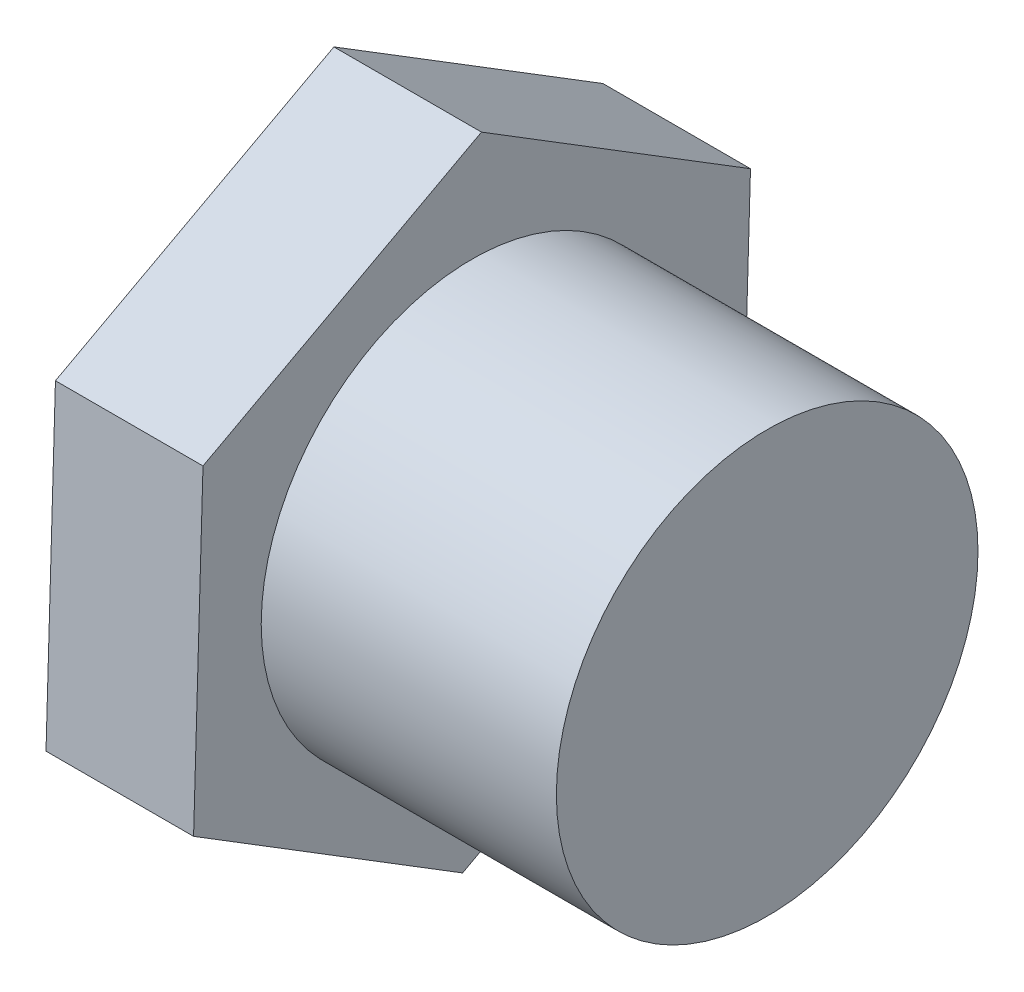
ISO-10303-21;
HEADER;
FILE_DESCRIPTION(('STEP AP214'),'2;1');
FILE_NAME('part.step','',(''),(''),'','','');
FILE_SCHEMA(('AUTOMOTIVE_DESIGN { 1 0 10303 214 1 1 1 1 }'));
ENDSEC;
DATA;
#1=APPLICATION_CONTEXT('core data for automotive mechanical design processes');
#2=APPLICATION_PROTOCOL_DEFINITION('international standard','automotive_design',2000,#1);
#3=PRODUCT_CONTEXT('',#1,'mechanical');
#4=PRODUCT('Part','Part','',(#3));
#5=PRODUCT_RELATED_PRODUCT_CATEGORY('part','',(#4));
#6=PRODUCT_DEFINITION_FORMATION('','',#4);
#7=PRODUCT_DEFINITION_CONTEXT('part definition',#1,'design');
#8=PRODUCT_DEFINITION('design','',#6,#7);
#9=PRODUCT_DEFINITION_SHAPE('','',#8);
#10=(LENGTH_UNIT() NAMED_UNIT(*) SI_UNIT(.MILLI.,.METRE.));
#11=(NAMED_UNIT(*) PLANE_ANGLE_UNIT() SI_UNIT($,.RADIAN.));
#12=(NAMED_UNIT(*) SI_UNIT($,.STERADIAN.) SOLID_ANGLE_UNIT());
#13=UNCERTAINTY_MEASURE_WITH_UNIT(LENGTH_MEASURE(1.E-05),#10,'distance_accuracy_value','');
#14=(GEOMETRIC_REPRESENTATION_CONTEXT(3) GLOBAL_UNCERTAINTY_ASSIGNED_CONTEXT((#13)) GLOBAL_UNIT_ASSIGNED_CONTEXT((#10,
#11,#12)) REPRESENTATION_CONTEXT('',''));
#15=CARTESIAN_POINT('',(0.,0.,0.));
#16=DIRECTION('',(0.,0.,1.));
#17=DIRECTION('',(1.,0.,0.));
#18=AXIS2_PLACEMENT_3D('',#15,#16,#17);
#19=CARTESIAN_POINT('',(-7.,0.,0.));
#20=DIRECTION('',(-1.,0.,0.));
#21=DIRECTION('',(0.,0.,1.));
#22=AXIS2_PLACEMENT_3D('',#19,#20,#21);
#23=PLANE('',#22);
#24=DIRECTION('',(0.,0.999555066672969,-0.0298273144683955));
#25=VECTOR('',#24,1.);
#26=CARTESIAN_POINT('',(-7.,0.387468180844465,12.9846012033036));
#27=LINE('',#26,#25);
#28=CARTESIAN_POINT('',(-7.,-7.10919481920279,13.2083060618166));
#29=VERTEX_POINT('',#28);
#30=CARTESIAN_POINT('',(-7.,7.88413118089174,12.7608963447906));
#31=VERTEX_POINT('',#30);
#32=EDGE_CURVE('E124',#29,#31,#27,.T.);
#33=ORIENTED_EDGE('',*,*,#32,.T.);
#34=DIRECTION('',(0.,0.473946321280187,-0.880553737454437));
#35=VECTOR('',#34,1.);
#36=CARTESIAN_POINT('',(-7.,11.4387285904931,6.15674331388235));
#37=LINE('',#36,#35);
#38=CARTESIAN_POINT('',(-7.,14.9933260000945,-0.447409717025914));
#39=VERTEX_POINT('',#38);
#40=EDGE_CURVE('E109',#31,#39,#37,.T.);
#41=ORIENTED_EDGE('',*,*,#40,.T.);
#42=DIRECTION('',(0.,-0.525608745392782,-0.850726422986042));
#43=VECTOR('',#42,1.);
#44=CARTESIAN_POINT('',(-7.,11.0512604096487,-6.82785788942124));
#45=LINE('',#44,#43);
#46=CARTESIAN_POINT('',(-7.,7.10919481920279,-13.2083060618166));
#47=VERTEX_POINT('',#46);
#48=EDGE_CURVE('E168',#39,#47,#45,.T.);
#49=ORIENTED_EDGE('',*,*,#48,.T.);
#50=DIRECTION('',(0.,-0.999555066672969,0.0298273144683954));
#51=VECTOR('',#50,1.);
#52=CARTESIAN_POINT('',(-7.,-0.387468180844463,-12.9846012033036));
#53=LINE('',#52,#51);
#54=CARTESIAN_POINT('',(-7.,-7.88413118089174,-12.7608963447906));
#55=VERTEX_POINT('',#54);
#56=EDGE_CURVE('E82',#47,#55,#53,.T.);
#57=ORIENTED_EDGE('',*,*,#56,.T.);
#58=DIRECTION('',(0.,-0.473946321280187,0.880553737454437));
#59=VECTOR('',#58,1.);
#60=CARTESIAN_POINT('',(-7.,-11.4387285904931,-6.15674331388235));
#61=LINE('',#60,#59);
#62=CARTESIAN_POINT('',(-7.,-14.9933260000945,0.447409717025928));
#63=VERTEX_POINT('',#62);
#64=EDGE_CURVE('E127',#55,#63,#61,.T.);
#65=ORIENTED_EDGE('',*,*,#64,.T.);
#66=DIRECTION('',(0.,0.525608745392782,0.850726422986042));
#67=VECTOR('',#66,1.);
#68=CARTESIAN_POINT('',(-7.,-11.0512604096487,6.82785788942124));
#69=LINE('',#68,#67);
#70=EDGE_CURVE('E132',#63,#29,#69,.T.);
#71=ORIENTED_EDGE('',*,*,#70,.T.);
#72=EDGE_LOOP('',(#33,#41,#49,#57,#65,#71));
#73=FACE_BOUND('',#72,.T.);
#74=ADVANCED_FACE('F58',(#73),#23,.T.);
#75=CARTESIAN_POINT('',(0.,0.,0.));
#76=DIRECTION('',(-1.,0.,0.));
#77=DIRECTION('',(0.,0.,1.));
#78=AXIS2_PLACEMENT_3D('',#75,#76,#77);
#79=PLANE('',#78);
#80=CARTESIAN_POINT('',(0.,0.,0.));
#81=DIRECTION('',(1.,0.,0.));
#82=DIRECTION('',(0.,0.,-1.));
#83=AXIS2_PLACEMENT_3D('',#80,#81,#82);
#84=CIRCLE('',#83,10.);
#85=CARTESIAN_POINT('',(0.,0.,-10.));
#86=VERTEX_POINT('',#85);
#87=EDGE_CURVE('E144',#86,#86,#84,.T.);
#88=ORIENTED_EDGE('',*,*,#87,.F.);
#89=EDGE_LOOP('',(#88));
#90=FACE_BOUND('',#89,.T.);
#91=DIRECTION('',(0.,0.473946321280187,-0.880553737454437));
#92=VECTOR('',#91,1.);
#93=CARTESIAN_POINT('',(0.,11.4387285904931,6.15674331388235));
#94=LINE('',#93,#92);
#95=CARTESIAN_POINT('',(0.,7.88413118089174,12.7608963447906));
#96=VERTEX_POINT('',#95);
#97=CARTESIAN_POINT('',(0.,14.9933260000945,-0.447409717025914));
#98=VERTEX_POINT('',#97);
#99=EDGE_CURVE('E73',#96,#98,#94,.T.);
#100=ORIENTED_EDGE('',*,*,#99,.F.);
#101=DIRECTION('',(0.,0.999555066672969,-0.0298273144683955));
#102=VECTOR('',#101,1.);
#103=CARTESIAN_POINT('',(0.,0.387468180844465,12.9846012033036));
#104=LINE('',#103,#102);
#105=CARTESIAN_POINT('',(0.,-7.10919481920279,13.2083060618166));
#106=VERTEX_POINT('',#105);
#107=EDGE_CURVE('E126',#106,#96,#104,.T.);
#108=ORIENTED_EDGE('',*,*,#107,.F.);
#109=DIRECTION('',(0.,0.525608745392782,0.850726422986042));
#110=VECTOR('',#109,1.);
#111=CARTESIAN_POINT('',(0.,-11.0512604096487,6.82785788942123));
#112=LINE('',#111,#110);
#113=CARTESIAN_POINT('',(0.,-14.9933260000945,0.447409717025928));
#114=VERTEX_POINT('',#113);
#115=EDGE_CURVE('E161',#114,#106,#112,.T.);
#116=ORIENTED_EDGE('',*,*,#115,.F.);
#117=DIRECTION('',(0.,-0.473946321280187,0.880553737454437));
#118=VECTOR('',#117,1.);
#119=CARTESIAN_POINT('',(0.,-11.4387285904931,-6.15674331388235));
#120=LINE('',#119,#118);
#121=CARTESIAN_POINT('',(0.,-7.88413118089174,-12.7608963447906));
#122=VERTEX_POINT('',#121);
#123=EDGE_CURVE('E66',#122,#114,#120,.T.);
#124=ORIENTED_EDGE('',*,*,#123,.F.);
#125=DIRECTION('',(0.,-0.999555066672969,0.0298273144683954));
#126=VECTOR('',#125,1.);
#127=CARTESIAN_POINT('',(0.,-0.387468180844463,-12.9846012033036));
#128=LINE('',#127,#126);
#129=CARTESIAN_POINT('',(0.,7.10919481920279,-13.2083060618166));
#130=VERTEX_POINT('',#129);
#131=EDGE_CURVE('E133',#130,#122,#128,.T.);
#132=ORIENTED_EDGE('',*,*,#131,.F.);
#133=DIRECTION('',(0.,-0.525608745392782,-0.850726422986042));
#134=VECTOR('',#133,1.);
#135=CARTESIAN_POINT('',(0.,11.0512604096487,-6.82785788942124));
#136=LINE('',#135,#134);
#137=EDGE_CURVE('E12',#98,#130,#136,.T.);
#138=ORIENTED_EDGE('',*,*,#137,.F.);
#139=EDGE_LOOP('',(#100,#108,#116,#124,#132,#138));
#140=FACE_BOUND('',#139,.T.);
#141=ADVANCED_FACE('F159',(#90,#140),#79,.F.);
#142=CARTESIAN_POINT('',(14.,0.,0.));
#143=DIRECTION('',(-1.,0.,0.));
#144=DIRECTION('',(0.,0.,1.));
#145=AXIS2_PLACEMENT_3D('',#142,#143,#144);
#146=CYLINDRICAL_SURFACE('',#145,10.);
#147=CARTESIAN_POINT('',(14.,0.,0.));
#148=DIRECTION('',(1.,0.,0.));
#149=DIRECTION('',(0.,0.,-1.));
#150=AXIS2_PLACEMENT_3D('',#147,#148,#149);
#151=CIRCLE('',#150,10.);
#152=CARTESIAN_POINT('',(14.,0.,-10.));
#153=VERTEX_POINT('',#152);
#154=EDGE_CURVE('E141',#153,#153,#151,.T.);
#155=ORIENTED_EDGE('',*,*,#154,.F.);
#156=EDGE_LOOP('',(#155));
#157=FACE_BOUND('',#156,.T.);
#158=ORIENTED_EDGE('',*,*,#87,.T.);
#159=EDGE_LOOP('',(#158));
#160=FACE_BOUND('',#159,.T.);
#161=ADVANCED_FACE('F60',(#157,#160),#146,.T.);
#162=CARTESIAN_POINT('',(14.,0.,0.));
#163=DIRECTION('',(1.,0.,0.));
#164=DIRECTION('',(0.,0.,-1.));
#165=AXIS2_PLACEMENT_3D('',#162,#163,#164);
#166=PLANE('',#165);
#167=ORIENTED_EDGE('',*,*,#154,.T.);
#168=EDGE_LOOP('',(#167));
#169=FACE_BOUND('',#168,.T.);
#170=ADVANCED_FACE('F192',(#169),#166,.T.);
#171=CARTESIAN_POINT('',(14.,0.387468180844465,12.9846012033036));
#172=DIRECTION('',(0.,0.0298273144683955,0.999555066672969));
#173=DIRECTION('',(0.,-0.999555066672969,0.0298273144683955));
#174=AXIS2_PLACEMENT_3D('',#171,#172,#173);
#175=PLANE('',#174);
#176=ORIENTED_EDGE('',*,*,#107,.T.);
#177=DIRECTION('',(-1.,0.,0.));
#178=VECTOR('',#177,1.);
#179=CARTESIAN_POINT('',(14.,7.88413118089174,12.7608963447906));
#180=LINE('',#179,#178);
#181=EDGE_CURVE('E112',#96,#31,#180,.T.);
#182=ORIENTED_EDGE('',*,*,#181,.T.);
#183=ORIENTED_EDGE('',*,*,#32,.F.);
#184=DIRECTION('',(-1.,0.,0.));
#185=VECTOR('',#184,1.);
#186=CARTESIAN_POINT('',(14.,-7.10919481920279,13.2083060618166));
#187=LINE('',#186,#185);
#188=EDGE_CURVE('E128',#106,#29,#187,.T.);
#189=ORIENTED_EDGE('',*,*,#188,.F.);
#190=EDGE_LOOP('',(#176,#182,#183,#189));
#191=FACE_BOUND('',#190,.T.);
#192=ADVANCED_FACE('F122',(#191),#175,.T.);
#193=CARTESIAN_POINT('',(14.,-11.4387285904931,-6.15674331388235));
#194=DIRECTION('',(0.,-0.880553737454437,-0.473946321280187));
#195=DIRECTION('',(0.,0.473946321280187,-0.880553737454437));
#196=AXIS2_PLACEMENT_3D('',#193,#194,#195);
#197=PLANE('',#196);
#198=ORIENTED_EDGE('',*,*,#123,.T.);
#199=DIRECTION('',(-1.,0.,0.));
#200=VECTOR('',#199,1.);
#201=CARTESIAN_POINT('',(14.,-14.9933260000945,0.447409717025928));
#202=LINE('',#201,#200);
#203=EDGE_CURVE('E155',#114,#63,#202,.T.);
#204=ORIENTED_EDGE('',*,*,#203,.T.);
#205=ORIENTED_EDGE('',*,*,#64,.F.);
#206=DIRECTION('',(-1.,0.,0.));
#207=VECTOR('',#206,1.);
#208=CARTESIAN_POINT('',(14.,-7.88413118089174,-12.7608963447906));
#209=LINE('',#208,#207);
#210=EDGE_CURVE('E138',#122,#55,#209,.T.);
#211=ORIENTED_EDGE('',*,*,#210,.F.);
#212=EDGE_LOOP('',(#198,#204,#205,#211));
#213=FACE_BOUND('',#212,.T.);
#214=ADVANCED_FACE('F153',(#213),#197,.T.);
#215=CARTESIAN_POINT('',(14.,11.0512604096487,-6.82785788942124));
#216=DIRECTION('',(0.,0.850726422986042,-0.525608745392782));
#217=DIRECTION('',(0.,0.525608745392782,0.850726422986042));
#218=AXIS2_PLACEMENT_3D('',#215,#216,#217);
#219=PLANE('',#218);
#220=ORIENTED_EDGE('',*,*,#137,.T.);
#221=DIRECTION('',(-1.,0.,0.));
#222=VECTOR('',#221,1.);
#223=CARTESIAN_POINT('',(14.,7.10919481920279,-13.2083060618166));
#224=LINE('',#223,#222);
#225=EDGE_CURVE('E147',#130,#47,#224,.T.);
#226=ORIENTED_EDGE('',*,*,#225,.T.);
#227=ORIENTED_EDGE('',*,*,#48,.F.);
#228=DIRECTION('',(-1.,0.,0.));
#229=VECTOR('',#228,1.);
#230=CARTESIAN_POINT('',(14.,14.9933260000945,-0.447409717025914));
#231=LINE('',#230,#229);
#232=EDGE_CURVE('E113',#98,#39,#231,.T.);
#233=ORIENTED_EDGE('',*,*,#232,.F.);
#234=EDGE_LOOP('',(#220,#226,#227,#233));
#235=FACE_BOUND('',#234,.T.);
#236=ADVANCED_FACE('F174',(#235),#219,.T.);
#237=CARTESIAN_POINT('',(14.,-0.387468180844463,-12.9846012033036));
#238=DIRECTION('',(0.,-0.0298273144683954,-0.999555066672969));
#239=DIRECTION('',(0.,0.999555066672969,-0.0298273144683954));
#240=AXIS2_PLACEMENT_3D('',#237,#238,#239);
#241=PLANE('',#240);
#242=ORIENTED_EDGE('',*,*,#131,.T.);
#243=ORIENTED_EDGE('',*,*,#210,.T.);
#244=ORIENTED_EDGE('',*,*,#56,.F.);
#245=ORIENTED_EDGE('',*,*,#225,.F.);
#246=EDGE_LOOP('',(#242,#243,#244,#245));
#247=FACE_BOUND('',#246,.T.);
#248=ADVANCED_FACE('F172',(#247),#241,.T.);
#249=CARTESIAN_POINT('',(14.,-11.0512604096487,6.82785788942124));
#250=DIRECTION('',(0.,-0.850726422986042,0.525608745392782));
#251=DIRECTION('',(0.,-0.525608745392782,-0.850726422986042));
#252=AXIS2_PLACEMENT_3D('',#249,#250,#251);
#253=PLANE('',#252);
#254=ORIENTED_EDGE('',*,*,#115,.T.);
#255=ORIENTED_EDGE('',*,*,#188,.T.);
#256=ORIENTED_EDGE('',*,*,#70,.F.);
#257=ORIENTED_EDGE('',*,*,#203,.F.);
#258=EDGE_LOOP('',(#254,#255,#256,#257));
#259=FACE_BOUND('',#258,.T.);
#260=ADVANCED_FACE('F181',(#259),#253,.T.);
#261=CARTESIAN_POINT('',(14.,11.4387285904931,6.15674331388235));
#262=DIRECTION('',(0.,0.880553737454437,0.473946321280187));
#263=DIRECTION('',(0.,-0.473946321280187,0.880553737454437));
#264=AXIS2_PLACEMENT_3D('',#261,#262,#263);
#265=PLANE('',#264);
#266=ORIENTED_EDGE('',*,*,#99,.T.);
#267=ORIENTED_EDGE('',*,*,#232,.T.);
#268=ORIENTED_EDGE('',*,*,#40,.F.);
#269=ORIENTED_EDGE('',*,*,#181,.F.);
#270=EDGE_LOOP('',(#266,#267,#268,#269));
#271=FACE_BOUND('',#270,.T.);
#272=ADVANCED_FACE('F111',(#271),#265,.T.);
#273=CLOSED_SHELL('',(#74,#141,#161,#170,#192,#214,#236,#248,#260,#272));
#274=MANIFOLD_SOLID_BREP('B2',#273);
#275=ADVANCED_BREP_SHAPE_REPRESENTATION('',(#18,#274),#14);
#276=SHAPE_DEFINITION_REPRESENTATION(#9,#275);
ENDSEC;
END-ISO-10303-21;
